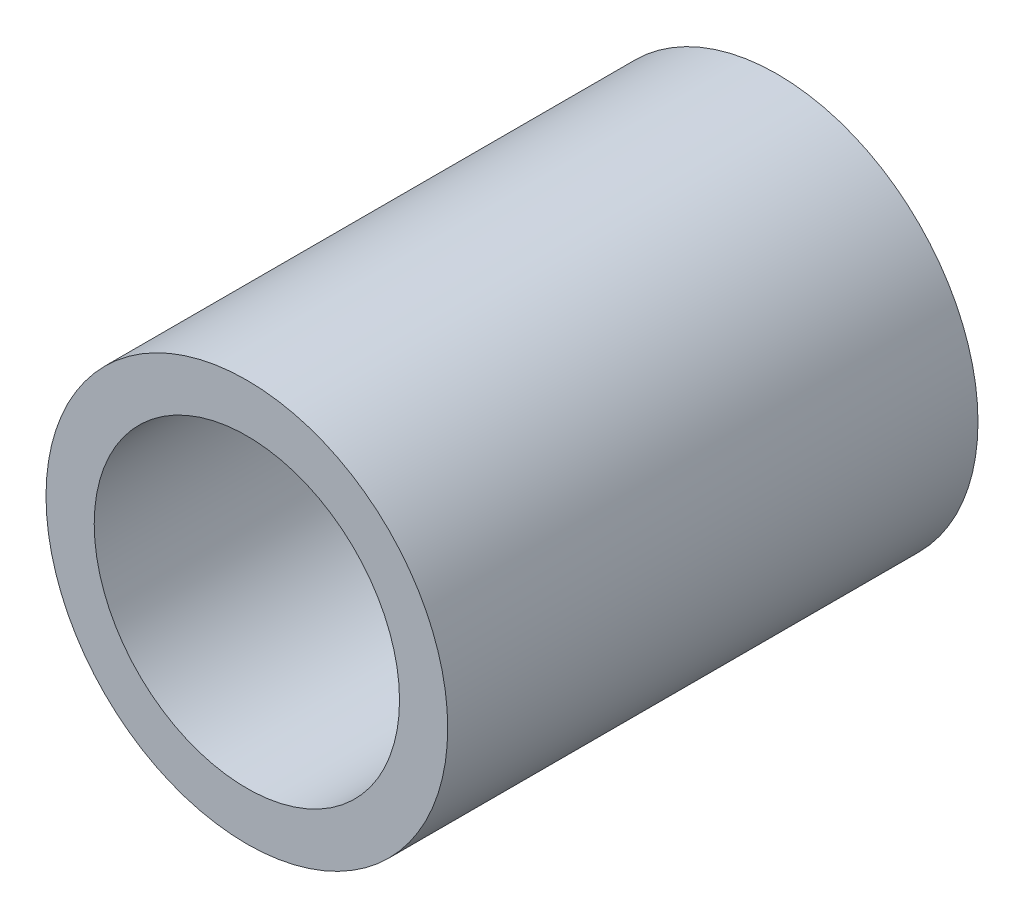
ISO-10303-21;
HEADER;
FILE_DESCRIPTION(('STEP AP214'),'2;1');
FILE_NAME('part.step','',(''),(''),'','','');
FILE_SCHEMA(('AUTOMOTIVE_DESIGN { 1 0 10303 214 1 1 1 1 }'));
ENDSEC;
DATA;
#1=APPLICATION_CONTEXT('core data for automotive mechanical design processes');
#2=APPLICATION_PROTOCOL_DEFINITION('international standard','automotive_design',2000,#1);
#3=PRODUCT_CONTEXT('',#1,'mechanical');
#4=PRODUCT('Part','Part','',(#3));
#5=PRODUCT_RELATED_PRODUCT_CATEGORY('part','',(#4));
#6=PRODUCT_DEFINITION_FORMATION('','',#4);
#7=PRODUCT_DEFINITION_CONTEXT('part definition',#1,'design');
#8=PRODUCT_DEFINITION('design','',#6,#7);
#9=PRODUCT_DEFINITION_SHAPE('','',#8);
#10=(LENGTH_UNIT() NAMED_UNIT(*) SI_UNIT(.MILLI.,.METRE.));
#11=(NAMED_UNIT(*) PLANE_ANGLE_UNIT() SI_UNIT($,.RADIAN.));
#12=(NAMED_UNIT(*) SI_UNIT($,.STERADIAN.) SOLID_ANGLE_UNIT());
#13=UNCERTAINTY_MEASURE_WITH_UNIT(LENGTH_MEASURE(1.E-05),#10,'distance_accuracy_value','');
#14=(GEOMETRIC_REPRESENTATION_CONTEXT(3) GLOBAL_UNCERTAINTY_ASSIGNED_CONTEXT((#13)) GLOBAL_UNIT_ASSIGNED_CONTEXT((#10,
#11,#12)) REPRESENTATION_CONTEXT('',''));
#15=CARTESIAN_POINT('',(0.,0.,0.));
#16=DIRECTION('',(0.,0.,1.));
#17=DIRECTION('',(1.,0.,0.));
#18=AXIS2_PLACEMENT_3D('',#15,#16,#17);
#19=CARTESIAN_POINT('',(0.,0.,6.6));
#20=DIRECTION('',(0.,0.,1.));
#21=DIRECTION('',(1.,0.,0.));
#22=AXIS2_PLACEMENT_3D('',#19,#20,#21);
#23=PLANE('',#22);
#24=CARTESIAN_POINT('',(0.,0.,6.6));
#25=DIRECTION('',(0.,0.,1.));
#26=DIRECTION('',(1.,0.,0.));
#27=AXIS2_PLACEMENT_3D('',#24,#25,#26);
#28=CIRCLE('',#27,2.5);
#29=CARTESIAN_POINT('',(2.5,0.,6.6));
#30=VERTEX_POINT('',#29);
#31=EDGE_CURVE('E10',#30,#30,#28,.T.);
#32=ORIENTED_EDGE('',*,*,#31,.T.);
#33=EDGE_LOOP('',(#32));
#34=FACE_BOUND('',#33,.T.);
#35=CARTESIAN_POINT('',(0.,0.,6.6));
#36=DIRECTION('',(0.,0.,1.));
#37=DIRECTION('',(1.,0.,0.));
#38=AXIS2_PLACEMENT_3D('',#35,#36,#37);
#39=CIRCLE('',#38,1.9);
#40=CARTESIAN_POINT('',(1.9,0.,6.6));
#41=VERTEX_POINT('',#40);
#42=EDGE_CURVE('E50',#41,#41,#39,.T.);
#43=ORIENTED_EDGE('',*,*,#42,.F.);
#44=EDGE_LOOP('',(#43));
#45=FACE_BOUND('',#44,.T.);
#46=ADVANCED_FACE('F37',(#34,#45),#23,.T.);
#47=CARTESIAN_POINT('',(0.,0.,0.));
#48=DIRECTION('',(0.,0.,1.));
#49=DIRECTION('',(1.,0.,0.));
#50=AXIS2_PLACEMENT_3D('',#47,#48,#49);
#51=PLANE('',#50);
#52=CARTESIAN_POINT('',(0.,0.,0.));
#53=DIRECTION('',(0.,0.,1.));
#54=DIRECTION('',(1.,0.,0.));
#55=AXIS2_PLACEMENT_3D('',#52,#53,#54);
#56=CIRCLE('',#55,2.5);
#57=CARTESIAN_POINT('',(2.5,0.,0.));
#58=VERTEX_POINT('',#57);
#59=EDGE_CURVE('E41',#58,#58,#56,.T.);
#60=ORIENTED_EDGE('',*,*,#59,.F.);
#61=EDGE_LOOP('',(#60));
#62=FACE_BOUND('',#61,.T.);
#63=CARTESIAN_POINT('',(0.,0.,0.));
#64=DIRECTION('',(0.,0.,1.));
#65=DIRECTION('',(1.,0.,0.));
#66=AXIS2_PLACEMENT_3D('',#63,#64,#65);
#67=CIRCLE('',#66,1.9);
#68=CARTESIAN_POINT('',(1.9,0.,0.));
#69=VERTEX_POINT('',#68);
#70=EDGE_CURVE('E52',#69,#69,#67,.T.);
#71=ORIENTED_EDGE('',*,*,#70,.T.);
#72=EDGE_LOOP('',(#71));
#73=FACE_BOUND('',#72,.T.);
#74=ADVANCED_FACE('F64',(#62,#73),#51,.F.);
#75=CARTESIAN_POINT('',(0.,0.,6.6));
#76=DIRECTION('',(0.,0.,-1.));
#77=DIRECTION('',(-1.,0.,0.));
#78=AXIS2_PLACEMENT_3D('',#75,#76,#77);
#79=CYLINDRICAL_SURFACE('',#78,2.5);
#80=ORIENTED_EDGE('',*,*,#31,.F.);
#81=EDGE_LOOP('',(#80));
#82=FACE_BOUND('',#81,.T.);
#83=ORIENTED_EDGE('',*,*,#59,.T.);
#84=EDGE_LOOP('',(#83));
#85=FACE_BOUND('',#84,.T.);
#86=ADVANCED_FACE('F39',(#82,#85),#79,.T.);
#87=CARTESIAN_POINT('',(0.,0.,6.6));
#88=DIRECTION('',(0.,0.,-1.));
#89=DIRECTION('',(-1.,0.,0.));
#90=AXIS2_PLACEMENT_3D('',#87,#88,#89);
#91=CYLINDRICAL_SURFACE('',#90,1.9);
#92=ORIENTED_EDGE('',*,*,#42,.T.);
#93=EDGE_LOOP('',(#92));
#94=FACE_BOUND('',#93,.T.);
#95=ORIENTED_EDGE('',*,*,#70,.F.);
#96=EDGE_LOOP('',(#95));
#97=FACE_BOUND('',#96,.T.);
#98=ADVANCED_FACE('F60',(#94,#97),#91,.F.);
#99=CLOSED_SHELL('',(#46,#74,#86,#98));
#100=MANIFOLD_SOLID_BREP('B2',#99);
#101=ADVANCED_BREP_SHAPE_REPRESENTATION('',(#18,#100),#14);
#102=SHAPE_DEFINITION_REPRESENTATION(#9,#101);
ENDSEC;
END-ISO-10303-21;
